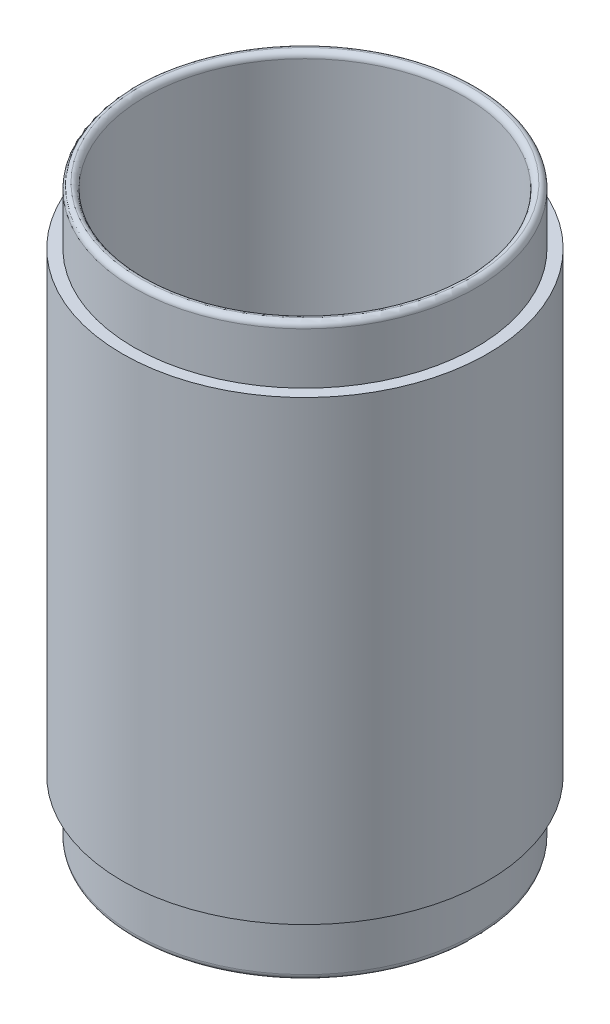
ISO-10303-21;
HEADER;
FILE_DESCRIPTION(('STEP AP214'),'2;1');
FILE_NAME('part.step','',(''),(''),'','','');
FILE_SCHEMA(('AUTOMOTIVE_DESIGN { 1 0 10303 214 1 1 1 1 }'));
ENDSEC;
DATA;
#1=APPLICATION_CONTEXT('core data for automotive mechanical design processes');
#2=APPLICATION_PROTOCOL_DEFINITION('international standard','automotive_design',2000,#1);
#3=PRODUCT_CONTEXT('',#1,'mechanical');
#4=PRODUCT('Part','Part','',(#3));
#5=PRODUCT_RELATED_PRODUCT_CATEGORY('part','',(#4));
#6=PRODUCT_DEFINITION_FORMATION('','',#4);
#7=PRODUCT_DEFINITION_CONTEXT('part definition',#1,'design');
#8=PRODUCT_DEFINITION('design','',#6,#7);
#9=PRODUCT_DEFINITION_SHAPE('','',#8);
#10=(LENGTH_UNIT() NAMED_UNIT(*) SI_UNIT(.MILLI.,.METRE.));
#11=(NAMED_UNIT(*) PLANE_ANGLE_UNIT() SI_UNIT($,.RADIAN.));
#12=(NAMED_UNIT(*) SI_UNIT($,.STERADIAN.) SOLID_ANGLE_UNIT());
#13=UNCERTAINTY_MEASURE_WITH_UNIT(LENGTH_MEASURE(1.E-05),#10,'distance_accuracy_value','');
#14=(GEOMETRIC_REPRESENTATION_CONTEXT(3) GLOBAL_UNCERTAINTY_ASSIGNED_CONTEXT((#13)) GLOBAL_UNIT_ASSIGNED_CONTEXT((#10,
#11,#12)) REPRESENTATION_CONTEXT('',''));
#15=CARTESIAN_POINT('',(0.,0.,0.));
#16=DIRECTION('',(0.,0.,1.));
#17=DIRECTION('',(1.,0.,0.));
#18=AXIS2_PLACEMENT_3D('',#15,#16,#17);
#19=CARTESIAN_POINT('',(0.,0.,0.));
#20=DIRECTION('',(0.,1.,0.));
#21=DIRECTION('',(0.,0.,1.));
#22=AXIS2_PLACEMENT_3D('',#19,#20,#21);
#23=PLANE('',#22);
#24=CARTESIAN_POINT('',(0.,0.,0.));
#25=DIRECTION('',(0.,1.,0.));
#26=DIRECTION('',(0.,0.,1.));
#27=AXIS2_PLACEMENT_3D('',#24,#25,#26);
#28=CIRCLE('',#27,16.);
#29=CARTESIAN_POINT('',(0.,0.,16.));
#30=VERTEX_POINT('',#29);
#31=EDGE_CURVE('E64',#30,#30,#28,.T.);
#32=ORIENTED_EDGE('',*,*,#31,.F.);
#33=EDGE_LOOP('',(#32));
#34=FACE_BOUND('',#33,.T.);
#35=CARTESIAN_POINT('',(0.,0.,0.));
#36=DIRECTION('',(0.,1.,0.));
#37=DIRECTION('',(0.,0.,1.));
#38=AXIS2_PLACEMENT_3D('',#35,#36,#37);
#39=CIRCLE('',#38,15.);
#40=CARTESIAN_POINT('',(0.,0.,15.));
#41=VERTEX_POINT('',#40);
#42=EDGE_CURVE('E119',#41,#41,#39,.F.);
#43=ORIENTED_EDGE('',*,*,#42,.F.);
#44=EDGE_LOOP('',(#43));
#45=FACE_BOUND('',#44,.T.);
#46=ADVANCED_FACE('F37',(#34,#45),#23,.F.);
#47=CARTESIAN_POINT('',(0.,40.,0.));
#48=DIRECTION('',(0.,1.,0.));
#49=DIRECTION('',(0.,0.,1.));
#50=AXIS2_PLACEMENT_3D('',#47,#48,#49);
#51=PLANE('',#50);
#52=CARTESIAN_POINT('',(0.,40.,0.));
#53=DIRECTION('',(0.,1.,0.));
#54=DIRECTION('',(0.,0.,1.));
#55=AXIS2_PLACEMENT_3D('',#52,#53,#54);
#56=CIRCLE('',#55,16.);
#57=CARTESIAN_POINT('',(0.,40.,16.));
#58=VERTEX_POINT('',#57);
#59=EDGE_CURVE('E125',#58,#58,#56,.T.);
#60=ORIENTED_EDGE('',*,*,#59,.T.);
#61=EDGE_LOOP('',(#60));
#62=FACE_BOUND('',#61,.T.);
#63=CARTESIAN_POINT('',(0.,40.,0.));
#64=DIRECTION('',(0.,1.,0.));
#65=DIRECTION('',(0.,0.,1.));
#66=AXIS2_PLACEMENT_3D('',#63,#64,#65);
#67=CIRCLE('',#66,15.);
#68=CARTESIAN_POINT('',(0.,40.,15.));
#69=VERTEX_POINT('',#68);
#70=EDGE_CURVE('E58',#69,#69,#67,.T.);
#71=ORIENTED_EDGE('',*,*,#70,.F.);
#72=EDGE_LOOP('',(#71));
#73=FACE_BOUND('',#72,.T.);
#74=ADVANCED_FACE('F83',(#62,#73),#51,.T.);
#75=CARTESIAN_POINT('',(0.,40.,0.));
#76=DIRECTION('',(0.,-1.,0.));
#77=DIRECTION('',(0.,0.,-1.));
#78=AXIS2_PLACEMENT_3D('',#75,#76,#77);
#79=CYLINDRICAL_SURFACE('',#78,16.);
#80=ORIENTED_EDGE('',*,*,#59,.F.);
#81=EDGE_LOOP('',(#80));
#82=FACE_BOUND('',#81,.T.);
#83=ORIENTED_EDGE('',*,*,#31,.T.);
#84=EDGE_LOOP('',(#83));
#85=FACE_BOUND('',#84,.T.);
#86=ADVANCED_FACE('F89',(#82,#85),#79,.T.);
#87=CARTESIAN_POINT('',(0.,40.,0.));
#88=DIRECTION('',(0.,-1.,0.));
#89=DIRECTION('',(0.,0.,-1.));
#90=AXIS2_PLACEMENT_3D('',#87,#88,#89);
#91=CYLINDRICAL_SURFACE('',#90,14.);
#92=CARTESIAN_POINT('',(0.,44.5,0.));
#93=DIRECTION('',(0.,1.,0.));
#94=DIRECTION('',(0.,0.,1.));
#95=AXIS2_PLACEMENT_3D('',#92,#93,#94);
#96=CIRCLE('',#95,14.);
#97=CARTESIAN_POINT('',(0.,44.5,14.));
#98=VERTEX_POINT('',#97);
#99=EDGE_CURVE('E46',#98,#98,#96,.T.);
#100=ORIENTED_EDGE('',*,*,#99,.T.);
#101=EDGE_LOOP('',(#100));
#102=FACE_BOUND('',#101,.T.);
#103=CARTESIAN_POINT('',(0.,-4.5,0.));
#104=DIRECTION('',(0.,-1.,0.));
#105=DIRECTION('',(0.,0.,-1.));
#106=AXIS2_PLACEMENT_3D('',#103,#104,#105);
#107=CIRCLE('',#106,14.);
#108=CARTESIAN_POINT('',(0.,-4.5,-14.));
#109=VERTEX_POINT('',#108);
#110=EDGE_CURVE('E52',#109,#109,#107,.T.);
#111=ORIENTED_EDGE('',*,*,#110,.T.);
#112=EDGE_LOOP('',(#111));
#113=FACE_BOUND('',#112,.T.);
#114=ADVANCED_FACE('F97',(#102,#113),#91,.F.);
#115=CARTESIAN_POINT('',(0.,45.,0.));
#116=DIRECTION('',(0.,-1.,0.));
#117=DIRECTION('',(0.,0.,-1.));
#118=AXIS2_PLACEMENT_3D('',#115,#116,#117);
#119=CYLINDRICAL_SURFACE('',#118,15.);
#120=CARTESIAN_POINT('',(0.,44.5,0.));
#121=DIRECTION('',(0.,1.,0.));
#122=DIRECTION('',(0.,0.,1.));
#123=AXIS2_PLACEMENT_3D('',#120,#121,#122);
#124=CIRCLE('',#123,15.);
#125=CARTESIAN_POINT('',(0.,44.5,15.));
#126=VERTEX_POINT('',#125);
#127=EDGE_CURVE('E116',#126,#126,#124,.F.);
#128=ORIENTED_EDGE('',*,*,#127,.T.);
#129=EDGE_LOOP('',(#128));
#130=FACE_BOUND('',#129,.T.);
#131=ORIENTED_EDGE('',*,*,#70,.T.);
#132=EDGE_LOOP('',(#131));
#133=FACE_BOUND('',#132,.T.);
#134=ADVANCED_FACE('F106',(#130,#133),#119,.T.);
#135=CARTESIAN_POINT('',(0.,-5.,0.));
#136=DIRECTION('',(0.,1.,0.));
#137=DIRECTION('',(0.,0.,1.));
#138=AXIS2_PLACEMENT_3D('',#135,#136,#137);
#139=CYLINDRICAL_SURFACE('',#138,15.);
#140=CARTESIAN_POINT('',(0.,-4.5,0.));
#141=DIRECTION('',(0.,-1.,0.));
#142=DIRECTION('',(0.,0.,-1.));
#143=AXIS2_PLACEMENT_3D('',#140,#141,#142);
#144=CIRCLE('',#143,15.);
#145=CARTESIAN_POINT('',(0.,-4.5,-15.));
#146=VERTEX_POINT('',#145);
#147=EDGE_CURVE('E10',#146,#146,#144,.F.);
#148=ORIENTED_EDGE('',*,*,#147,.T.);
#149=EDGE_LOOP('',(#148));
#150=FACE_BOUND('',#149,.T.);
#151=ORIENTED_EDGE('',*,*,#42,.T.);
#152=EDGE_LOOP('',(#151));
#153=FACE_BOUND('',#152,.T.);
#154=ADVANCED_FACE('F101',(#150,#153),#139,.T.);
#155=CARTESIAN_POINT('',(0.,44.5,0.));
#156=DIRECTION('',(0.,1.,0.));
#157=DIRECTION('',(0.,0.,1.));
#158=AXIS2_PLACEMENT_3D('',#155,#156,#157);
#159=TOROIDAL_SURFACE('',#158,14.5,0.5);
#160=ORIENTED_EDGE('',*,*,#99,.F.);
#161=EDGE_LOOP('',(#160));
#162=FACE_BOUND('',#161,.T.);
#163=CARTESIAN_POINT('',(0.,45.,0.));
#164=DIRECTION('',(0.,1.,0.));
#165=DIRECTION('',(0.,0.,1.));
#166=AXIS2_PLACEMENT_3D('',#163,#164,#165);
#167=CIRCLE('',#166,14.5);
#168=CARTESIAN_POINT('',(0.,45.,14.5));
#169=VERTEX_POINT('',#168);
#170=EDGE_CURVE('E55',#169,#169,#167,.F.);
#171=ORIENTED_EDGE('',*,*,#170,.F.);
#172=EDGE_LOOP('',(#171));
#173=FACE_BOUND('',#172,.T.);
#174=ADVANCED_FACE('F79',(#162,#173),#159,.T.);
#175=CARTESIAN_POINT('',(0.,44.5,0.));
#176=DIRECTION('',(0.,1.,0.));
#177=DIRECTION('',(0.,0.,1.));
#178=AXIS2_PLACEMENT_3D('',#175,#176,#177);
#179=TOROIDAL_SURFACE('',#178,14.5,0.5);
#180=ORIENTED_EDGE('',*,*,#127,.F.);
#181=EDGE_LOOP('',(#180));
#182=FACE_BOUND('',#181,.T.);
#183=ORIENTED_EDGE('',*,*,#170,.T.);
#184=EDGE_LOOP('',(#183));
#185=FACE_BOUND('',#184,.T.);
#186=ADVANCED_FACE('F73',(#182,#185),#179,.T.);
#187=CARTESIAN_POINT('',(0.,-4.5,0.));
#188=DIRECTION('',(0.,-1.,0.));
#189=DIRECTION('',(0.,0.,-1.));
#190=AXIS2_PLACEMENT_3D('',#187,#188,#189);
#191=TOROIDAL_SURFACE('',#190,14.5,0.5);
#192=ORIENTED_EDGE('',*,*,#147,.F.);
#193=EDGE_LOOP('',(#192));
#194=FACE_BOUND('',#193,.T.);
#195=CARTESIAN_POINT('',(0.,-5.,0.));
#196=DIRECTION('',(0.,-1.,0.));
#197=DIRECTION('',(0.,0.,-1.));
#198=AXIS2_PLACEMENT_3D('',#195,#196,#197);
#199=CIRCLE('',#198,14.5);
#200=CARTESIAN_POINT('',(0.,-5.,-14.5));
#201=VERTEX_POINT('',#200);
#202=EDGE_CURVE('E41',#201,#201,#199,.T.);
#203=ORIENTED_EDGE('',*,*,#202,.F.);
#204=EDGE_LOOP('',(#203));
#205=FACE_BOUND('',#204,.T.);
#206=ADVANCED_FACE('F39',(#194,#205),#191,.T.);
#207=CARTESIAN_POINT('',(0.,-4.5,0.));
#208=DIRECTION('',(0.,-1.,0.));
#209=DIRECTION('',(0.,0.,-1.));
#210=AXIS2_PLACEMENT_3D('',#207,#208,#209);
#211=TOROIDAL_SURFACE('',#210,14.5,0.5);
#212=ORIENTED_EDGE('',*,*,#202,.T.);
#213=EDGE_LOOP('',(#212));
#214=FACE_BOUND('',#213,.T.);
#215=ORIENTED_EDGE('',*,*,#110,.F.);
#216=EDGE_LOOP('',(#215));
#217=FACE_BOUND('',#216,.T.);
#218=ADVANCED_FACE('F69',(#214,#217),#211,.T.);
#219=CLOSED_SHELL('',(#46,#74,#86,#114,#134,#154,#174,#186,#206,#218));
#220=MANIFOLD_SOLID_BREP('B2',#219);
#221=ADVANCED_BREP_SHAPE_REPRESENTATION('',(#18,#220),#14);
#222=SHAPE_DEFINITION_REPRESENTATION(#9,#221);
ENDSEC;
END-ISO-10303-21;
